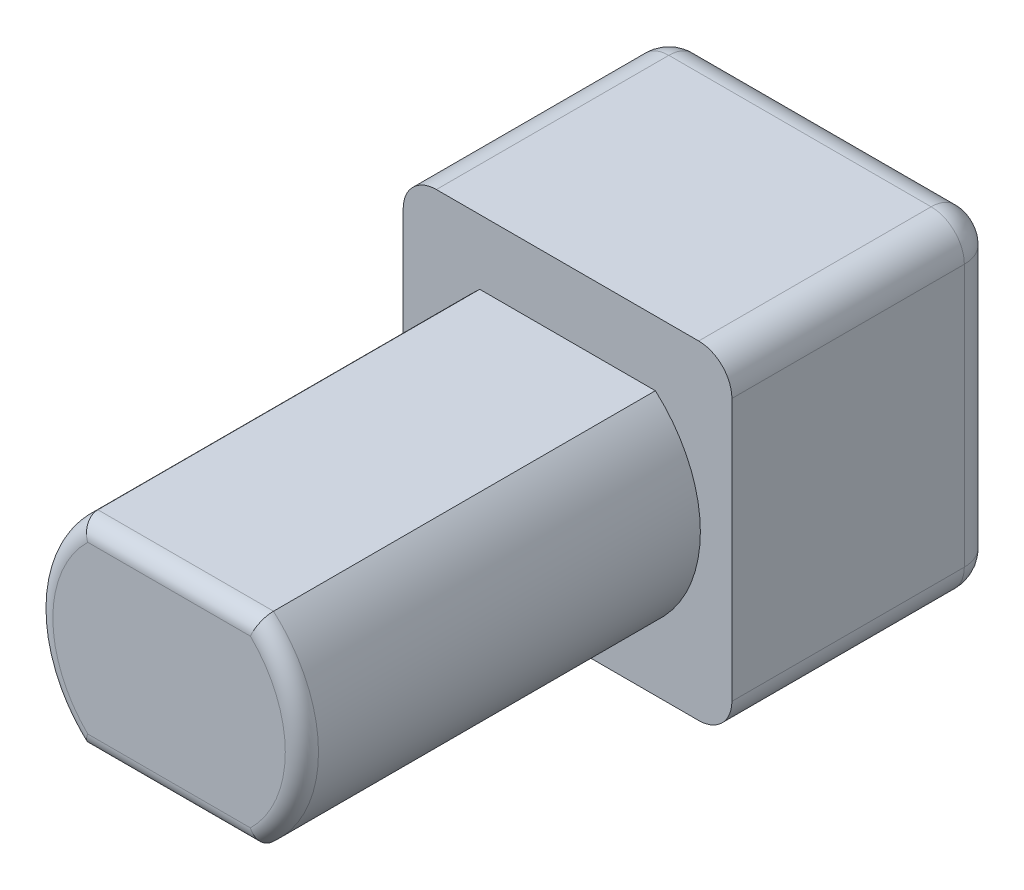
ISO-10303-21;
HEADER;
FILE_DESCRIPTION(('STEP AP214'),'2;1');
FILE_NAME('part.step','',(''),(''),'','','');
FILE_SCHEMA(('AUTOMOTIVE_DESIGN { 1 0 10303 214 1 1 1 1 }'));
ENDSEC;
DATA;
#1=APPLICATION_CONTEXT('core data for automotive mechanical design processes');
#2=APPLICATION_PROTOCOL_DEFINITION('international standard','automotive_design',2000,#1);
#3=PRODUCT_CONTEXT('',#1,'mechanical');
#4=PRODUCT('Part','Part','',(#3));
#5=PRODUCT_RELATED_PRODUCT_CATEGORY('part','',(#4));
#6=PRODUCT_DEFINITION_FORMATION('','',#4);
#7=PRODUCT_DEFINITION_CONTEXT('part definition',#1,'design');
#8=PRODUCT_DEFINITION('design','',#6,#7);
#9=PRODUCT_DEFINITION_SHAPE('','',#8);
#10=(LENGTH_UNIT() NAMED_UNIT(*) SI_UNIT(.MILLI.,.METRE.));
#11=(NAMED_UNIT(*) PLANE_ANGLE_UNIT() SI_UNIT($,.RADIAN.));
#12=(NAMED_UNIT(*) SI_UNIT($,.STERADIAN.) SOLID_ANGLE_UNIT());
#13=UNCERTAINTY_MEASURE_WITH_UNIT(LENGTH_MEASURE(1.E-05),#10,'distance_accuracy_value','');
#14=(GEOMETRIC_REPRESENTATION_CONTEXT(3) GLOBAL_UNCERTAINTY_ASSIGNED_CONTEXT((#13)) GLOBAL_UNIT_ASSIGNED_CONTEXT((#10,
#11,#12)) REPRESENTATION_CONTEXT('',''));
#15=CARTESIAN_POINT('',(0.,0.,0.));
#16=DIRECTION('',(0.,0.,1.));
#17=DIRECTION('',(1.,0.,0.));
#18=AXIS2_PLACEMENT_3D('',#15,#16,#17);
#19=CARTESIAN_POINT('',(-2.47487373415292,-2.47487373415292,0.));
#20=DIRECTION('',(0.,0.,1.));
#21=DIRECTION('',(1.,0.,0.));
#22=AXIS2_PLACEMENT_3D('',#19,#20,#21);
#23=PLANE('',#22);
#24=DIRECTION('',(1.,0.,0.));
#25=VECTOR('',#24,1.);
#26=CARTESIAN_POINT('',(-2.47487373415292,-2.47487373415292,0.));
#27=LINE('',#26,#25);
#28=CARTESIAN_POINT('',(-1.97487373415292,-2.47487373415292,0.));
#29=VERTEX_POINT('',#28);
#30=CARTESIAN_POINT('',(1.97487373415292,-2.47487373415292,0.));
#31=VERTEX_POINT('',#30);
#32=EDGE_CURVE('E180',#29,#31,#27,.T.);
#33=ORIENTED_EDGE('',*,*,#32,.T.);
#34=CARTESIAN_POINT('',(1.97487373415292,-1.97487373415292,0.));
#35=DIRECTION('',(0.,0.,1.));
#36=DIRECTION('',(1.,0.,0.));
#37=AXIS2_PLACEMENT_3D('',#34,#35,#36);
#38=CIRCLE('',#37,0.5);
#39=CARTESIAN_POINT('',(2.47487373415292,-1.97487373415292,0.));
#40=VERTEX_POINT('',#39);
#41=EDGE_CURVE('E202',#31,#40,#38,.T.);
#42=ORIENTED_EDGE('',*,*,#41,.T.);
#43=DIRECTION('',(0.,1.,0.));
#44=VECTOR('',#43,1.);
#45=CARTESIAN_POINT('',(2.47487373415292,2.47487373415292,0.));
#46=LINE('',#45,#44);
#47=CARTESIAN_POINT('',(2.47487373415292,1.97487373415292,0.));
#48=VERTEX_POINT('',#47);
#49=EDGE_CURVE('E183',#40,#48,#46,.T.);
#50=ORIENTED_EDGE('',*,*,#49,.T.);
#51=CARTESIAN_POINT('',(1.97487373415292,1.97487373415292,0.));
#52=DIRECTION('',(0.,0.,1.));
#53=DIRECTION('',(1.,0.,0.));
#54=AXIS2_PLACEMENT_3D('',#51,#52,#53);
#55=CIRCLE('',#54,0.5);
#56=CARTESIAN_POINT('',(1.97487373415292,2.47487373415292,0.));
#57=VERTEX_POINT('',#56);
#58=EDGE_CURVE('E200',#48,#57,#55,.T.);
#59=ORIENTED_EDGE('',*,*,#58,.T.);
#60=DIRECTION('',(-1.,0.,0.));
#61=VECTOR('',#60,1.);
#62=CARTESIAN_POINT('',(-2.47487373415292,2.47487373415292,0.));
#63=LINE('',#62,#61);
#64=CARTESIAN_POINT('',(-1.97487373415292,2.47487373415292,0.));
#65=VERTEX_POINT('',#64);
#66=EDGE_CURVE('E186',#57,#65,#63,.T.);
#67=ORIENTED_EDGE('',*,*,#66,.T.);
#68=CARTESIAN_POINT('',(-1.97487373415292,1.97487373415292,0.));
#69=DIRECTION('',(0.,0.,1.));
#70=DIRECTION('',(1.,0.,0.));
#71=AXIS2_PLACEMENT_3D('',#68,#69,#70);
#72=CIRCLE('',#71,0.5);
#73=CARTESIAN_POINT('',(-2.47487373415292,1.97487373415292,0.));
#74=VERTEX_POINT('',#73);
#75=EDGE_CURVE('E196',#65,#74,#72,.T.);
#76=ORIENTED_EDGE('',*,*,#75,.T.);
#77=DIRECTION('',(0.,-1.,0.));
#78=VECTOR('',#77,1.);
#79=CARTESIAN_POINT('',(-2.47487373415292,2.47487373415292,0.));
#80=LINE('',#79,#78);
#81=CARTESIAN_POINT('',(-2.47487373415292,-1.97487373415292,0.));
#82=VERTEX_POINT('',#81);
#83=EDGE_CURVE('E154',#74,#82,#80,.T.);
#84=ORIENTED_EDGE('',*,*,#83,.T.);
#85=CARTESIAN_POINT('',(-1.97487373415292,-1.97487373415292,0.));
#86=DIRECTION('',(0.,0.,1.));
#87=DIRECTION('',(1.,0.,0.));
#88=AXIS2_PLACEMENT_3D('',#85,#86,#87);
#89=CIRCLE('',#88,0.5);
#90=EDGE_CURVE('E198',#82,#29,#89,.T.);
#91=ORIENTED_EDGE('',*,*,#90,.T.);
#92=EDGE_LOOP('',(#33,#42,#50,#59,#67,#76,#84,#91));
#93=FACE_BOUND('',#92,.T.);
#94=DIRECTION('',(1.,0.,0.));
#95=VECTOR('',#94,1.);
#96=CARTESIAN_POINT('',(-1.3228756555323,-1.5,0.));
#97=LINE('',#96,#95);
#98=CARTESIAN_POINT('',(-1.3228756555323,-1.5,0.));
#99=VERTEX_POINT('',#98);
#100=CARTESIAN_POINT('',(1.32287565553229,-1.5,0.));
#101=VERTEX_POINT('',#100);
#102=EDGE_CURVE('E150',#99,#101,#97,.T.);
#103=ORIENTED_EDGE('',*,*,#102,.F.);
#104=CARTESIAN_POINT('',(0.,0.,0.));
#105=DIRECTION('',(0.,0.,1.));
#106=DIRECTION('',(1.,0.,0.));
#107=AXIS2_PLACEMENT_3D('',#104,#105,#106);
#108=CIRCLE('',#107,2.);
#109=CARTESIAN_POINT('',(-1.3228756555323,1.5,0.));
#110=VERTEX_POINT('',#109);
#111=EDGE_CURVE('E158',#110,#99,#108,.T.);
#112=ORIENTED_EDGE('',*,*,#111,.F.);
#113=DIRECTION('',(-1.,0.,0.));
#114=VECTOR('',#113,1.);
#115=CARTESIAN_POINT('',(-1.3228756555323,1.5,0.));
#116=LINE('',#115,#114);
#117=CARTESIAN_POINT('',(1.32287565553229,1.5,0.));
#118=VERTEX_POINT('',#117);
#119=EDGE_CURVE('E170',#118,#110,#116,.T.);
#120=ORIENTED_EDGE('',*,*,#119,.F.);
#121=CARTESIAN_POINT('',(0.,0.,0.));
#122=DIRECTION('',(0.,0.,1.));
#123=DIRECTION('',(1.,0.,0.));
#124=AXIS2_PLACEMENT_3D('',#121,#122,#123);
#125=CIRCLE('',#124,2.);
#126=EDGE_CURVE('E168',#101,#118,#125,.T.);
#127=ORIENTED_EDGE('',*,*,#126,.F.);
#128=EDGE_LOOP('',(#103,#112,#120,#127));
#129=FACE_BOUND('',#128,.T.);
#130=ADVANCED_FACE('F30',(#93,#129),#23,.T.);
#131=CARTESIAN_POINT('',(-2.47487373415292,2.47487373415292,-4.));
#132=DIRECTION('',(-1.,0.,0.));
#133=DIRECTION('',(0.,-1.,0.));
#134=AXIS2_PLACEMENT_3D('',#131,#132,#133);
#135=PLANE('',#134);
#136=DIRECTION('',(0.,-1.,0.));
#137=VECTOR('',#136,1.);
#138=CARTESIAN_POINT('',(-2.47487373415292,-2.47487373415292,-3.5));
#139=LINE('',#138,#137);
#140=CARTESIAN_POINT('',(-2.47487373415292,1.97487373415292,-3.5));
#141=VERTEX_POINT('',#140);
#142=CARTESIAN_POINT('',(-2.47487373415292,-1.97487373415292,-3.5));
#143=VERTEX_POINT('',#142);
#144=EDGE_CURVE('E227',#141,#143,#139,.T.);
#145=ORIENTED_EDGE('',*,*,#144,.T.);
#146=DIRECTION('',(0.,0.,1.));
#147=VECTOR('',#146,1.);
#148=CARTESIAN_POINT('',(-2.47487373415292,-1.97487373415292,-4.));
#149=LINE('',#148,#147);
#150=EDGE_CURVE('E229',#143,#82,#149,.T.);
#151=ORIENTED_EDGE('',*,*,#150,.T.);
#152=ORIENTED_EDGE('',*,*,#83,.F.);
#153=DIRECTION('',(0.,0.,1.));
#154=VECTOR('',#153,1.);
#155=CARTESIAN_POINT('',(-2.47487373415292,1.97487373415292,-4.));
#156=LINE('',#155,#154);
#157=EDGE_CURVE('E225',#74,#141,#156,.F.);
#158=ORIENTED_EDGE('',*,*,#157,.T.);
#159=EDGE_LOOP('',(#145,#151,#152,#158));
#160=FACE_BOUND('',#159,.T.);
#161=ADVANCED_FACE('F335',(#160),#135,.T.);
#162=CARTESIAN_POINT('',(-2.47487373415292,2.47487373415292,-4.));
#163=DIRECTION('',(0.,1.,0.));
#164=DIRECTION('',(0.,0.,1.));
#165=AXIS2_PLACEMENT_3D('',#162,#163,#164);
#166=PLANE('',#165);
#167=ORIENTED_EDGE('',*,*,#66,.F.);
#168=DIRECTION('',(0.,0.,1.));
#169=VECTOR('',#168,1.);
#170=CARTESIAN_POINT('',(1.97487373415292,2.47487373415292,-4.));
#171=LINE('',#170,#169);
#172=CARTESIAN_POINT('',(1.97487373415292,2.47487373415292,-3.5));
#173=VERTEX_POINT('',#172);
#174=EDGE_CURVE('E214',#57,#173,#171,.F.);
#175=ORIENTED_EDGE('',*,*,#174,.T.);
#176=DIRECTION('',(-1.,0.,0.));
#177=VECTOR('',#176,1.);
#178=CARTESIAN_POINT('',(-2.47487373415292,2.47487373415292,-3.5));
#179=LINE('',#178,#177);
#180=CARTESIAN_POINT('',(-1.97487373415292,2.47487373415292,-3.5));
#181=VERTEX_POINT('',#180);
#182=EDGE_CURVE('E212',#173,#181,#179,.T.);
#183=ORIENTED_EDGE('',*,*,#182,.T.);
#184=DIRECTION('',(0.,0.,1.));
#185=VECTOR('',#184,1.);
#186=CARTESIAN_POINT('',(-1.97487373415292,2.47487373415292,-4.));
#187=LINE('',#186,#185);
#188=EDGE_CURVE('E210',#181,#65,#187,.T.);
#189=ORIENTED_EDGE('',*,*,#188,.T.);
#190=EDGE_LOOP('',(#167,#175,#183,#189));
#191=FACE_BOUND('',#190,.T.);
#192=ADVANCED_FACE('F341',(#191),#166,.T.);
#193=CARTESIAN_POINT('',(2.47487373415292,2.47487373415292,-4.));
#194=DIRECTION('',(1.,0.,0.));
#195=DIRECTION('',(0.,1.,0.));
#196=AXIS2_PLACEMENT_3D('',#193,#194,#195);
#197=PLANE('',#196);
#198=ORIENTED_EDGE('',*,*,#49,.F.);
#199=DIRECTION('',(0.,0.,1.));
#200=VECTOR('',#199,1.);
#201=CARTESIAN_POINT('',(2.47487373415292,-1.97487373415292,-4.));
#202=LINE('',#201,#200);
#203=CARTESIAN_POINT('',(2.47487373415292,-1.97487373415292,-3.5));
#204=VERTEX_POINT('',#203);
#205=EDGE_CURVE('E208',#40,#204,#202,.F.);
#206=ORIENTED_EDGE('',*,*,#205,.T.);
#207=DIRECTION('',(0.,1.,0.));
#208=VECTOR('',#207,1.);
#209=CARTESIAN_POINT('',(2.47487373415292,2.47487373415292,-3.5));
#210=LINE('',#209,#208);
#211=CARTESIAN_POINT('',(2.47487373415292,1.97487373415292,-3.5));
#212=VERTEX_POINT('',#211);
#213=EDGE_CURVE('E204',#204,#212,#210,.T.);
#214=ORIENTED_EDGE('',*,*,#213,.T.);
#215=DIRECTION('',(0.,0.,1.));
#216=VECTOR('',#215,1.);
#217=CARTESIAN_POINT('',(2.47487373415292,1.97487373415292,-4.));
#218=LINE('',#217,#216);
#219=EDGE_CURVE('E206',#212,#48,#218,.T.);
#220=ORIENTED_EDGE('',*,*,#219,.T.);
#221=EDGE_LOOP('',(#198,#206,#214,#220));
#222=FACE_BOUND('',#221,.T.);
#223=ADVANCED_FACE('F350',(#222),#197,.T.);
#224=CARTESIAN_POINT('',(-2.47487373415292,-2.47487373415292,-4.));
#225=DIRECTION('',(0.,-1.,0.));
#226=DIRECTION('',(0.,0.,-1.));
#227=AXIS2_PLACEMENT_3D('',#224,#225,#226);
#228=PLANE('',#227);
#229=DIRECTION('',(1.,0.,0.));
#230=VECTOR('',#229,1.);
#231=CARTESIAN_POINT('',(2.47487373415292,-2.47487373415292,-3.5));
#232=LINE('',#231,#230);
#233=CARTESIAN_POINT('',(-1.97487373415292,-2.47487373415292,-3.5));
#234=VERTEX_POINT('',#233);
#235=CARTESIAN_POINT('',(1.97487373415292,-2.47487373415292,-3.5));
#236=VERTEX_POINT('',#235);
#237=EDGE_CURVE('E191',#234,#236,#232,.T.);
#238=ORIENTED_EDGE('',*,*,#237,.T.);
#239=DIRECTION('',(0.,0.,1.));
#240=VECTOR('',#239,1.);
#241=CARTESIAN_POINT('',(1.97487373415292,-2.47487373415292,-4.));
#242=LINE('',#241,#240);
#243=EDGE_CURVE('E193',#236,#31,#242,.T.);
#244=ORIENTED_EDGE('',*,*,#243,.T.);
#245=ORIENTED_EDGE('',*,*,#32,.F.);
#246=DIRECTION('',(0.,0.,1.));
#247=VECTOR('',#246,1.);
#248=CARTESIAN_POINT('',(-1.97487373415292,-2.47487373415292,-4.));
#249=LINE('',#248,#247);
#250=EDGE_CURVE('E189',#29,#234,#249,.F.);
#251=ORIENTED_EDGE('',*,*,#250,.T.);
#252=EDGE_LOOP('',(#238,#244,#245,#251));
#253=FACE_BOUND('',#252,.T.);
#254=ADVANCED_FACE('F354',(#253),#228,.T.);
#255=CARTESIAN_POINT('',(-2.47487373415292,-2.47487373415292,-4.));
#256=DIRECTION('',(0.,0.,1.));
#257=DIRECTION('',(1.,0.,0.));
#258=AXIS2_PLACEMENT_3D('',#255,#256,#257);
#259=PLANE('',#258);
#260=DIRECTION('',(0.,-1.,0.));
#261=VECTOR('',#260,1.);
#262=CARTESIAN_POINT('',(-1.97487373415292,2.47487373415292,-4.));
#263=LINE('',#262,#261);
#264=CARTESIAN_POINT('',(-1.97487373415292,-1.97487373415292,-4.));
#265=VERTEX_POINT('',#264);
#266=CARTESIAN_POINT('',(-1.97487373415292,1.97487373415292,-4.));
#267=VERTEX_POINT('',#266);
#268=EDGE_CURVE('E216',#265,#267,#263,.F.);
#269=ORIENTED_EDGE('',*,*,#268,.T.);
#270=DIRECTION('',(-1.,0.,0.));
#271=VECTOR('',#270,1.);
#272=CARTESIAN_POINT('',(2.47487373415292,1.97487373415292,-4.));
#273=LINE('',#272,#271);
#274=CARTESIAN_POINT('',(1.97487373415292,1.97487373415292,-4.));
#275=VERTEX_POINT('',#274);
#276=EDGE_CURVE('E222',#267,#275,#273,.F.);
#277=ORIENTED_EDGE('',*,*,#276,.T.);
#278=DIRECTION('',(0.,1.,0.));
#279=VECTOR('',#278,1.);
#280=CARTESIAN_POINT('',(1.97487373415292,-2.47487373415292,-4.));
#281=LINE('',#280,#279);
#282=CARTESIAN_POINT('',(1.97487373415292,-1.97487373415292,-4.));
#283=VERTEX_POINT('',#282);
#284=EDGE_CURVE('E220',#275,#283,#281,.F.);
#285=ORIENTED_EDGE('',*,*,#284,.T.);
#286=DIRECTION('',(1.,0.,0.));
#287=VECTOR('',#286,1.);
#288=CARTESIAN_POINT('',(-2.47487373415292,-1.97487373415292,-4.));
#289=LINE('',#288,#287);
#290=EDGE_CURVE('E218',#283,#265,#289,.F.);
#291=ORIENTED_EDGE('',*,*,#290,.T.);
#292=EDGE_LOOP('',(#269,#277,#285,#291));
#293=FACE_BOUND('',#292,.T.);
#294=ADVANCED_FACE('F346',(#293),#259,.F.);
#295=CARTESIAN_POINT('',(0.,0.,6.));
#296=DIRECTION('',(0.,0.,-1.));
#297=DIRECTION('',(-1.,0.,0.));
#298=AXIS2_PLACEMENT_3D('',#295,#296,#297);
#299=CYLINDRICAL_SURFACE('',#298,2.);
#300=DIRECTION('',(0.,0.,-1.));
#301=VECTOR('',#300,1.);
#302=CARTESIAN_POINT('',(-1.3228756555323,-1.5,6.));
#303=LINE('',#302,#301);
#304=CARTESIAN_POINT('',(-1.3228756555323,-1.5,5.75));
#305=VERTEX_POINT('',#304);
#306=EDGE_CURVE('E146',#305,#99,#303,.T.);
#307=ORIENTED_EDGE('',*,*,#306,.F.);
#308=CARTESIAN_POINT('',(0.,0.,5.75));
#309=DIRECTION('',(0.,0.,1.));
#310=DIRECTION('',(1.,0.,0.));
#311=AXIS2_PLACEMENT_3D('',#308,#309,#310);
#312=CIRCLE('',#311,2.);
#313=CARTESIAN_POINT('',(-1.3228756555323,1.5,5.75));
#314=VERTEX_POINT('',#313);
#315=EDGE_CURVE('E11',#305,#314,#312,.F.);
#316=ORIENTED_EDGE('',*,*,#315,.T.);
#317=DIRECTION('',(0.,0.,-1.));
#318=VECTOR('',#317,1.);
#319=CARTESIAN_POINT('',(-1.3228756555323,1.5,6.));
#320=LINE('',#319,#318);
#321=EDGE_CURVE('E161',#314,#110,#320,.T.);
#322=ORIENTED_EDGE('',*,*,#321,.T.);
#323=ORIENTED_EDGE('',*,*,#111,.T.);
#324=EDGE_LOOP('',(#307,#316,#322,#323));
#325=FACE_BOUND('',#324,.T.);
#326=ADVANCED_FACE('F159',(#325),#299,.T.);
#327=CARTESIAN_POINT('',(-1.3228756555323,-1.5,6.));
#328=DIRECTION('',(0.,1.,0.));
#329=DIRECTION('',(0.,0.,1.));
#330=AXIS2_PLACEMENT_3D('',#327,#328,#329);
#331=PLANE('',#330);
#332=DIRECTION('',(0.,0.,-1.));
#333=VECTOR('',#332,1.);
#334=CARTESIAN_POINT('',(1.32287565553229,-1.5,6.));
#335=LINE('',#334,#333);
#336=CARTESIAN_POINT('',(1.32287565553229,-1.5,5.75));
#337=VERTEX_POINT('',#336);
#338=EDGE_CURVE('E155',#337,#101,#335,.T.);
#339=ORIENTED_EDGE('',*,*,#338,.F.);
#340=DIRECTION('',(1.,0.,0.));
#341=VECTOR('',#340,1.);
#342=CARTESIAN_POINT('',(-1.3228756555323,-1.5,5.75));
#343=LINE('',#342,#341);
#344=EDGE_CURVE('E43',#337,#305,#343,.F.);
#345=ORIENTED_EDGE('',*,*,#344,.T.);
#346=ORIENTED_EDGE('',*,*,#306,.T.);
#347=ORIENTED_EDGE('',*,*,#102,.T.);
#348=EDGE_LOOP('',(#339,#345,#346,#347));
#349=FACE_BOUND('',#348,.T.);
#350=ADVANCED_FACE('F148',(#349),#331,.F.);
#351=CARTESIAN_POINT('',(0.,0.,6.));
#352=DIRECTION('',(0.,0.,-1.));
#353=DIRECTION('',(-1.,0.,0.));
#354=AXIS2_PLACEMENT_3D('',#351,#352,#353);
#355=CYLINDRICAL_SURFACE('',#354,2.);
#356=DIRECTION('',(0.,0.,-1.));
#357=VECTOR('',#356,1.);
#358=CARTESIAN_POINT('',(1.32287565553229,1.5,6.));
#359=LINE('',#358,#357);
#360=CARTESIAN_POINT('',(1.32287565553229,1.5,5.75));
#361=VERTEX_POINT('',#360);
#362=EDGE_CURVE('E175',#361,#118,#359,.T.);
#363=ORIENTED_EDGE('',*,*,#362,.F.);
#364=CARTESIAN_POINT('',(0.,0.,5.75));
#365=DIRECTION('',(0.,0.,1.));
#366=DIRECTION('',(1.,0.,0.));
#367=AXIS2_PLACEMENT_3D('',#364,#365,#366);
#368=CIRCLE('',#367,2.);
#369=EDGE_CURVE('E58',#361,#337,#368,.F.);
#370=ORIENTED_EDGE('',*,*,#369,.T.);
#371=ORIENTED_EDGE('',*,*,#338,.T.);
#372=ORIENTED_EDGE('',*,*,#126,.T.);
#373=EDGE_LOOP('',(#363,#370,#371,#372));
#374=FACE_BOUND('',#373,.T.);
#375=ADVANCED_FACE('F319',(#374),#355,.T.);
#376=CARTESIAN_POINT('',(-1.3228756555323,1.5,6.));
#377=DIRECTION('',(0.,-1.,0.));
#378=DIRECTION('',(0.,0.,-1.));
#379=AXIS2_PLACEMENT_3D('',#376,#377,#378);
#380=PLANE('',#379);
#381=ORIENTED_EDGE('',*,*,#321,.F.);
#382=DIRECTION('',(-1.,0.,0.));
#383=VECTOR('',#382,1.);
#384=CARTESIAN_POINT('',(1.32287565553229,1.5,5.75));
#385=LINE('',#384,#383);
#386=EDGE_CURVE('E275',#314,#361,#385,.F.);
#387=ORIENTED_EDGE('',*,*,#386,.T.);
#388=ORIENTED_EDGE('',*,*,#362,.T.);
#389=ORIENTED_EDGE('',*,*,#119,.T.);
#390=EDGE_LOOP('',(#381,#387,#388,#389));
#391=FACE_BOUND('',#390,.T.);
#392=ADVANCED_FACE('F318',(#391),#380,.F.);
#393=CARTESIAN_POINT('',(0.,0.,6.));
#394=DIRECTION('',(0.,0.,1.));
#395=DIRECTION('',(1.,0.,0.));
#396=AXIS2_PLACEMENT_3D('',#393,#394,#395);
#397=PLANE('',#396);
#398=CARTESIAN_POINT('',(0.,0.,6.));
#399=DIRECTION('',(0.,0.,1.));
#400=DIRECTION('',(1.,0.,0.));
#401=AXIS2_PLACEMENT_3D('',#398,#399,#400);
#402=CIRCLE('',#401,1.75);
#403=CARTESIAN_POINT('',(1.22474487139239,-1.25,6.));
#404=VERTEX_POINT('',#403);
#405=CARTESIAN_POINT('',(1.22474487139239,1.24999999999921,6.));
#406=VERTEX_POINT('',#405);
#407=EDGE_CURVE('E270',#404,#406,#402,.T.);
#408=ORIENTED_EDGE('',*,*,#407,.T.);
#409=DIRECTION('',(-1.,0.,0.));
#410=VECTOR('',#409,1.);
#411=CARTESIAN_POINT('',(-1.3228756555323,1.25,6.));
#412=LINE('',#411,#410);
#413=CARTESIAN_POINT('',(-1.22474487139239,1.24999999999921,6.));
#414=VERTEX_POINT('',#413);
#415=EDGE_CURVE('E272',#406,#414,#412,.T.);
#416=ORIENTED_EDGE('',*,*,#415,.T.);
#417=CARTESIAN_POINT('',(0.,0.,6.));
#418=DIRECTION('',(0.,0.,1.));
#419=DIRECTION('',(1.,0.,0.));
#420=AXIS2_PLACEMENT_3D('',#417,#418,#419);
#421=CIRCLE('',#420,1.75);
#422=CARTESIAN_POINT('',(-1.22474487139239,-1.24999999999921,6.));
#423=VERTEX_POINT('',#422);
#424=EDGE_CURVE('E231',#414,#423,#421,.T.);
#425=ORIENTED_EDGE('',*,*,#424,.T.);
#426=DIRECTION('',(1.,0.,0.));
#427=VECTOR('',#426,1.);
#428=CARTESIAN_POINT('',(1.32287565553229,-1.25,6.));
#429=LINE('',#428,#427);
#430=EDGE_CURVE('E268',#423,#404,#429,.T.);
#431=ORIENTED_EDGE('',*,*,#430,.T.);
#432=EDGE_LOOP('',(#408,#416,#425,#431));
#433=FACE_BOUND('',#432,.T.);
#434=ADVANCED_FACE('F323',(#433),#397,.T.);
#435=CARTESIAN_POINT('',(-1.97487373415292,1.97487373415292,-4.));
#436=DIRECTION('',(0.,0.,1.));
#437=DIRECTION('',(1.,0.,0.));
#438=AXIS2_PLACEMENT_3D('',#435,#436,#437);
#439=CYLINDRICAL_SURFACE('',#438,0.5);
#440=CARTESIAN_POINT('',(-1.97487373415292,1.97487373415292,-3.5));
#441=DIRECTION('',(0.,0.,-1.));
#442=DIRECTION('',(-1.,0.,0.));
#443=AXIS2_PLACEMENT_3D('',#440,#441,#442);
#444=CIRCLE('',#443,0.5);
#445=EDGE_CURVE('E165',#141,#181,#444,.T.);
#446=ORIENTED_EDGE('',*,*,#445,.F.);
#447=ORIENTED_EDGE('',*,*,#157,.F.);
#448=ORIENTED_EDGE('',*,*,#75,.F.);
#449=ORIENTED_EDGE('',*,*,#188,.F.);
#450=EDGE_LOOP('',(#446,#447,#448,#449));
#451=FACE_BOUND('',#450,.T.);
#452=ADVANCED_FACE('F325',(#451),#439,.T.);
#453=CARTESIAN_POINT('',(-1.97487373415292,1.97487373415292,-3.5));
#454=DIRECTION('',(0.,0.,1.));
#455=DIRECTION('',(1.,0.,0.));
#456=AXIS2_PLACEMENT_3D('',#453,#454,#455);
#457=SPHERICAL_SURFACE('',#456,0.5);
#458=CARTESIAN_POINT('',(-1.97487373415292,1.97487373415292,-3.5));
#459=DIRECTION('',(0.,1.,0.));
#460=DIRECTION('',(0.,0.,1.));
#461=AXIS2_PLACEMENT_3D('',#458,#459,#460);
#462=CIRCLE('',#461,0.5);
#463=EDGE_CURVE('E259',#141,#267,#462,.F.);
#464=ORIENTED_EDGE('',*,*,#463,.F.);
#465=ORIENTED_EDGE('',*,*,#445,.T.);
#466=CARTESIAN_POINT('',(-1.97487373415292,1.97487373415292,-3.5));
#467=DIRECTION('',(-1.,0.,0.));
#468=DIRECTION('',(0.,0.,1.));
#469=AXIS2_PLACEMENT_3D('',#466,#467,#468);
#470=CIRCLE('',#469,0.5);
#471=EDGE_CURVE('E262',#267,#181,#470,.F.);
#472=ORIENTED_EDGE('',*,*,#471,.F.);
#473=EDGE_LOOP('',(#464,#465,#472));
#474=FACE_BOUND('',#473,.T.);
#475=ADVANCED_FACE('F331',(#474),#457,.T.);
#476=CARTESIAN_POINT('',(1.97487373415292,1.97487373415292,-4.));
#477=DIRECTION('',(0.,0.,1.));
#478=DIRECTION('',(1.,0.,0.));
#479=AXIS2_PLACEMENT_3D('',#476,#477,#478);
#480=CYLINDRICAL_SURFACE('',#479,0.5);
#481=ORIENTED_EDGE('',*,*,#58,.F.);
#482=ORIENTED_EDGE('',*,*,#219,.F.);
#483=CARTESIAN_POINT('',(1.97487373415292,1.97487373415292,-3.5));
#484=DIRECTION('',(0.,0.,-1.));
#485=DIRECTION('',(-1.,0.,0.));
#486=AXIS2_PLACEMENT_3D('',#483,#484,#485);
#487=CIRCLE('',#486,0.5);
#488=EDGE_CURVE('E256',#173,#212,#487,.T.);
#489=ORIENTED_EDGE('',*,*,#488,.F.);
#490=ORIENTED_EDGE('',*,*,#174,.F.);
#491=EDGE_LOOP('',(#481,#482,#489,#490));
#492=FACE_BOUND('',#491,.T.);
#493=ADVANCED_FACE('F394',(#492),#480,.T.);
#494=CARTESIAN_POINT('',(-2.47487373415292,1.97487373415292,-3.5));
#495=DIRECTION('',(1.,0.,0.));
#496=DIRECTION('',(0.,0.,-1.));
#497=AXIS2_PLACEMENT_3D('',#494,#495,#496);
#498=CYLINDRICAL_SURFACE('',#497,0.5);
#499=ORIENTED_EDGE('',*,*,#471,.T.);
#500=ORIENTED_EDGE('',*,*,#182,.F.);
#501=CARTESIAN_POINT('',(1.97487373415292,1.97487373415292,-3.5));
#502=DIRECTION('',(1.,0.,0.));
#503=DIRECTION('',(0.,0.,-1.));
#504=AXIS2_PLACEMENT_3D('',#501,#502,#503);
#505=CIRCLE('',#504,0.5);
#506=EDGE_CURVE('E253',#275,#173,#505,.T.);
#507=ORIENTED_EDGE('',*,*,#506,.F.);
#508=ORIENTED_EDGE('',*,*,#276,.F.);
#509=EDGE_LOOP('',(#499,#500,#507,#508));
#510=FACE_BOUND('',#509,.T.);
#511=ADVANCED_FACE('F390',(#510),#498,.T.);
#512=CARTESIAN_POINT('',(-1.97487373415292,2.47487373415292,-3.5));
#513=DIRECTION('',(0.,1.,0.));
#514=DIRECTION('',(-1.,0.,0.));
#515=AXIS2_PLACEMENT_3D('',#512,#513,#514);
#516=CYLINDRICAL_SURFACE('',#515,0.5);
#517=ORIENTED_EDGE('',*,*,#463,.T.);
#518=ORIENTED_EDGE('',*,*,#268,.F.);
#519=CARTESIAN_POINT('',(-1.97487373415292,-1.97487373415292,-3.5));
#520=DIRECTION('',(0.,-1.,0.));
#521=DIRECTION('',(0.,0.,-1.));
#522=AXIS2_PLACEMENT_3D('',#519,#520,#521);
#523=CIRCLE('',#522,0.5);
#524=EDGE_CURVE('E250',#143,#265,#523,.T.);
#525=ORIENTED_EDGE('',*,*,#524,.F.);
#526=ORIENTED_EDGE('',*,*,#144,.F.);
#527=EDGE_LOOP('',(#517,#518,#525,#526));
#528=FACE_BOUND('',#527,.T.);
#529=ADVANCED_FACE('F386',(#528),#516,.T.);
#530=CARTESIAN_POINT('',(-1.97487373415292,-1.97487373415292,-4.));
#531=DIRECTION('',(0.,0.,1.));
#532=DIRECTION('',(1.,0.,0.));
#533=AXIS2_PLACEMENT_3D('',#530,#531,#532);
#534=CYLINDRICAL_SURFACE('',#533,0.5);
#535=ORIENTED_EDGE('',*,*,#90,.F.);
#536=ORIENTED_EDGE('',*,*,#150,.F.);
#537=CARTESIAN_POINT('',(-1.97487373415292,-1.97487373415292,-3.5));
#538=DIRECTION('',(0.,0.,-1.));
#539=DIRECTION('',(-1.,0.,0.));
#540=AXIS2_PLACEMENT_3D('',#537,#538,#539);
#541=CIRCLE('',#540,0.5);
#542=EDGE_CURVE('E247',#234,#143,#541,.T.);
#543=ORIENTED_EDGE('',*,*,#542,.F.);
#544=ORIENTED_EDGE('',*,*,#250,.F.);
#545=EDGE_LOOP('',(#535,#536,#543,#544));
#546=FACE_BOUND('',#545,.T.);
#547=ADVANCED_FACE('F382',(#546),#534,.T.);
#548=CARTESIAN_POINT('',(1.97487373415292,1.97487373415292,-3.5));
#549=DIRECTION('',(0.,0.,1.));
#550=DIRECTION('',(1.,0.,0.));
#551=AXIS2_PLACEMENT_3D('',#548,#549,#550);
#552=SPHERICAL_SURFACE('',#551,0.5);
#553=ORIENTED_EDGE('',*,*,#506,.T.);
#554=ORIENTED_EDGE('',*,*,#488,.T.);
#555=CARTESIAN_POINT('',(1.97487373415292,1.97487373415292,-3.5));
#556=DIRECTION('',(0.,1.,0.));
#557=DIRECTION('',(0.,0.,1.));
#558=AXIS2_PLACEMENT_3D('',#555,#556,#557);
#559=CIRCLE('',#558,0.5);
#560=EDGE_CURVE('E244',#275,#212,#559,.F.);
#561=ORIENTED_EDGE('',*,*,#560,.F.);
#562=EDGE_LOOP('',(#553,#554,#561));
#563=FACE_BOUND('',#562,.T.);
#564=ADVANCED_FACE('F378',(#563),#552,.T.);
#565=CARTESIAN_POINT('',(-1.97487373415292,-1.97487373415292,-3.5));
#566=DIRECTION('',(0.,0.,1.));
#567=DIRECTION('',(1.,0.,0.));
#568=AXIS2_PLACEMENT_3D('',#565,#566,#567);
#569=SPHERICAL_SURFACE('',#568,0.5);
#570=ORIENTED_EDGE('',*,*,#542,.T.);
#571=ORIENTED_EDGE('',*,*,#524,.T.);
#572=CARTESIAN_POINT('',(-1.97487373415292,-1.97487373415292,-3.5));
#573=DIRECTION('',(-1.,0.,0.));
#574=DIRECTION('',(0.,0.,1.));
#575=AXIS2_PLACEMENT_3D('',#572,#573,#574);
#576=CIRCLE('',#575,0.5);
#577=EDGE_CURVE('E241',#234,#265,#576,.F.);
#578=ORIENTED_EDGE('',*,*,#577,.F.);
#579=EDGE_LOOP('',(#570,#571,#578));
#580=FACE_BOUND('',#579,.T.);
#581=ADVANCED_FACE('F374',(#580),#569,.T.);
#582=CARTESIAN_POINT('',(1.97487373415292,2.47487373415292,-3.5));
#583=DIRECTION('',(0.,-1.,0.));
#584=DIRECTION('',(1.,0.,0.));
#585=AXIS2_PLACEMENT_3D('',#582,#583,#584);
#586=CYLINDRICAL_SURFACE('',#585,0.5);
#587=ORIENTED_EDGE('',*,*,#560,.T.);
#588=ORIENTED_EDGE('',*,*,#213,.F.);
#589=CARTESIAN_POINT('',(1.97487373415292,-1.97487373415292,-3.5));
#590=DIRECTION('',(0.,-1.,0.));
#591=DIRECTION('',(0.,0.,-1.));
#592=AXIS2_PLACEMENT_3D('',#589,#590,#591);
#593=CIRCLE('',#592,0.5);
#594=EDGE_CURVE('E238',#283,#204,#593,.T.);
#595=ORIENTED_EDGE('',*,*,#594,.F.);
#596=ORIENTED_EDGE('',*,*,#284,.F.);
#597=EDGE_LOOP('',(#587,#588,#595,#596));
#598=FACE_BOUND('',#597,.T.);
#599=ADVANCED_FACE('F370',(#598),#586,.T.);
#600=CARTESIAN_POINT('',(-2.47487373415292,-1.97487373415292,-3.5));
#601=DIRECTION('',(-1.,0.,0.));
#602=DIRECTION('',(0.,0.,1.));
#603=AXIS2_PLACEMENT_3D('',#600,#601,#602);
#604=CYLINDRICAL_SURFACE('',#603,0.5);
#605=ORIENTED_EDGE('',*,*,#577,.T.);
#606=ORIENTED_EDGE('',*,*,#290,.F.);
#607=CARTESIAN_POINT('',(1.97487373415292,-1.97487373415292,-3.5));
#608=DIRECTION('',(1.,0.,0.));
#609=DIRECTION('',(0.,0.,-1.));
#610=AXIS2_PLACEMENT_3D('',#607,#608,#609);
#611=CIRCLE('',#610,0.5);
#612=EDGE_CURVE('E235',#236,#283,#611,.T.);
#613=ORIENTED_EDGE('',*,*,#612,.F.);
#614=ORIENTED_EDGE('',*,*,#237,.F.);
#615=EDGE_LOOP('',(#605,#606,#613,#614));
#616=FACE_BOUND('',#615,.T.);
#617=ADVANCED_FACE('F366',(#616),#604,.T.);
#618=CARTESIAN_POINT('',(1.97487373415292,-1.97487373415292,-3.5));
#619=DIRECTION('',(0.,0.,1.));
#620=DIRECTION('',(1.,0.,0.));
#621=AXIS2_PLACEMENT_3D('',#618,#619,#620);
#622=SPHERICAL_SURFACE('',#621,0.5);
#623=ORIENTED_EDGE('',*,*,#612,.T.);
#624=ORIENTED_EDGE('',*,*,#594,.T.);
#625=CARTESIAN_POINT('',(1.97487373415292,-1.97487373415292,-3.5));
#626=DIRECTION('',(0.,0.,-1.));
#627=DIRECTION('',(-1.,0.,0.));
#628=AXIS2_PLACEMENT_3D('',#625,#626,#627);
#629=CIRCLE('',#628,0.5);
#630=EDGE_CURVE('E232',#236,#204,#629,.F.);
#631=ORIENTED_EDGE('',*,*,#630,.F.);
#632=EDGE_LOOP('',(#623,#624,#631));
#633=FACE_BOUND('',#632,.T.);
#634=ADVANCED_FACE('F362',(#633),#622,.T.);
#635=CARTESIAN_POINT('',(1.97487373415292,-1.97487373415292,-4.));
#636=DIRECTION('',(0.,0.,1.));
#637=DIRECTION('',(1.,0.,0.));
#638=AXIS2_PLACEMENT_3D('',#635,#636,#637);
#639=CYLINDRICAL_SURFACE('',#638,0.5);
#640=ORIENTED_EDGE('',*,*,#630,.T.);
#641=ORIENTED_EDGE('',*,*,#205,.F.);
#642=ORIENTED_EDGE('',*,*,#41,.F.);
#643=ORIENTED_EDGE('',*,*,#243,.F.);
#644=EDGE_LOOP('',(#640,#641,#642,#643));
#645=FACE_BOUND('',#644,.T.);
#646=ADVANCED_FACE('F359',(#645),#639,.T.);
#647=CARTESIAN_POINT('',(0.,-1.25,5.75));
#648=DIRECTION('',(-1.,0.,0.));
#649=DIRECTION('',(0.,0.,1.));
#650=AXIS2_PLACEMENT_3D('',#647,#648,#649);
#651=CYLINDRICAL_SURFACE('',#650,0.25);
#652=CARTESIAN_POINT('',(-1.3228756555323,-1.5,5.75));
#653=CARTESIAN_POINT('',(-1.32288043942927,-1.50001460787941,5.76339823933284));
#654=CARTESIAN_POINT('',(-1.32246892663244,-1.49892391777188,5.7767879483732));
#655=CARTESIAN_POINT('',(-1.32085064101542,-1.49464524935072,5.80314632535262));
#656=CARTESIAN_POINT('',(-1.31964580663411,-1.49146238318972,5.8161159389312));
#657=CARTESIAN_POINT('',(-1.31647807766724,-1.48311218348259,5.84129746751821));
#658=CARTESIAN_POINT('',(-1.31451527479418,-1.47794509002397,5.85350947398799));
#659=CARTESIAN_POINT('',(-1.3098950548356,-1.46581969869838,5.87686589855548));
#660=CARTESIAN_POINT('',(-1.30723745938367,-1.45886094088421,5.88801004150704));
#661=CARTESIAN_POINT('',(-1.30122881024574,-1.44318719702933,5.90923969998412));
#662=CARTESIAN_POINT('',(-1.29786171477706,-1.43443173434541,5.91929072074697));
#663=CARTESIAN_POINT('',(-1.29057163987912,-1.41556188140365,5.93778695848247));
#664=CARTESIAN_POINT('',(-1.28664847604926,-1.4054470404135,5.94623164058473));
#665=CARTESIAN_POINT('',(-1.27809046920039,-1.38349585727951,5.96182796891935));
#666=CARTESIAN_POINT('',(-1.27342673744297,-1.37159198545756,5.96886857071026));
#667=CARTESIAN_POINT('',(-1.26370315417488,-1.34692205802764,5.98085535882696));
#668=CARTESIAN_POINT('',(-1.25864323113848,-1.33415584679605,5.98580116593474));
#669=CARTESIAN_POINT('',(-1.24904647270933,-1.31009767186742,5.99294216585484));
#670=CARTESIAN_POINT('',(-1.24454808435024,-1.2988790677508,5.99544246450432));
#671=CARTESIAN_POINT('',(-1.23543121828063,-1.27626960286655,5.9988779562786));
#672=CARTESIAN_POINT('',(-1.23081297654502,-1.26487909669027,5.99981601823614));
#673=CARTESIAN_POINT('',(-1.22569709047827,-1.25233312672412,5.99999185278595));
#674=CARTESIAN_POINT('',(-1.22522107311834,-1.25116644581299,6.00000001968268));
#675=CARTESIAN_POINT('',(-1.22474487139159,-1.25,6.));
#676=B_SPLINE_CURVE_WITH_KNOTS('',3,(#652,#653,#654,#655,#656,#657,#658,#659,#660,#661,#662,
#663,#664,#665,#666,#667,#668,#669,#670,#671,#672,#673,#674,#675),.UNSPECIFIED.,.F.,.F.,(4,2,2,
2,2,2,2,2,2,2,2,4),(0.,0.040130942721209,0.0801641897123576,0.12019259428663,0.160231285017947,
0.201297188863015,0.242376742777165,0.285975335064153,0.329581816579232,0.366515158141393,
0.403380601613962,0.40716071947177),.UNSPECIFIED.);
#677=EDGE_CURVE('E301',#305,#423,#676,.T.);
#678=ORIENTED_EDGE('',*,*,#677,.F.);
#679=ORIENTED_EDGE('',*,*,#344,.F.);
#680=CARTESIAN_POINT('',(1.32287565553229,-1.5,5.75));
#681=CARTESIAN_POINT('',(1.32288043942927,-1.50001460787941,5.76339823933284));
#682=CARTESIAN_POINT('',(1.32246892663244,-1.49892391777188,5.7767879483732));
#683=CARTESIAN_POINT('',(1.32085064101542,-1.49464524935072,5.80314632535262));
#684=CARTESIAN_POINT('',(1.31964580663411,-1.49146238318972,5.8161159389312));
#685=CARTESIAN_POINT('',(1.31647807766724,-1.48311218348259,5.84129746751821));
#686=CARTESIAN_POINT('',(1.31451527479418,-1.47794509002397,5.85350947398799));
#687=CARTESIAN_POINT('',(1.3098950548356,-1.46581969869838,5.87686589855548));
#688=CARTESIAN_POINT('',(1.30723745938367,-1.45886094088421,5.88801004150704));
#689=CARTESIAN_POINT('',(1.30122881024574,-1.44318719702933,5.90923969998412));
#690=CARTESIAN_POINT('',(1.29786171477706,-1.43443173434541,5.91929072074697));
#691=CARTESIAN_POINT('',(1.29057163987912,-1.41556188140365,5.93778695848247));
#692=CARTESIAN_POINT('',(1.28664847604926,-1.4054470404135,5.94623164058473));
#693=CARTESIAN_POINT('',(1.27809046920039,-1.38349585727951,5.96182796891935));
#694=CARTESIAN_POINT('',(1.27342673744297,-1.37159198545756,5.96886857071026));
#695=CARTESIAN_POINT('',(1.26370315417488,-1.34692205802764,5.98085535882696));
#696=CARTESIAN_POINT('',(1.25864323113848,-1.33415584679605,5.98580116593474));
#697=CARTESIAN_POINT('',(1.24904647270933,-1.31009767186742,5.99294216585484));
#698=CARTESIAN_POINT('',(1.24454808435024,-1.2988790677508,5.99544246450432));
#699=CARTESIAN_POINT('',(1.23543121828063,-1.27626960286655,5.9988779562786));
#700=CARTESIAN_POINT('',(1.23081297654502,-1.26487909669027,5.99981601823614));
#701=CARTESIAN_POINT('',(1.22569709047827,-1.25233312672412,5.99999185278595));
#702=CARTESIAN_POINT('',(1.22522107311833,-1.25116644581299,6.00000001968268));
#703=CARTESIAN_POINT('',(1.22474487139159,-1.25,6.));
#704=B_SPLINE_CURVE_WITH_KNOTS('',3,(#680,#681,#682,#683,#684,#685,#686,#687,#688,#689,#690,
#691,#692,#693,#694,#695,#696,#697,#698,#699,#700,#701,#702,#703),.UNSPECIFIED.,.F.,.F.,(4,2,2,
2,2,2,2,2,2,2,2,4),(0.,0.040130942721209,0.0801641897123577,0.12019259428663,0.160231285017947,
0.201297188863015,0.242376742777165,0.285975335064153,0.329581816579232,0.366515158141393,
0.403380601613962,0.407160719471769),.UNSPECIFIED.);
#705=EDGE_CURVE('E35',#404,#337,#704,.F.);
#706=ORIENTED_EDGE('',*,*,#705,.F.);
#707=ORIENTED_EDGE('',*,*,#430,.F.);
#708=EDGE_LOOP('',(#678,#679,#706,#707));
#709=FACE_BOUND('',#708,.T.);
#710=ADVANCED_FACE('F32',(#709),#651,.T.);
#711=CARTESIAN_POINT('',(0.,0.,5.75));
#712=DIRECTION('',(0.,0.,1.));
#713=DIRECTION('',(1.,0.,0.));
#714=AXIS2_PLACEMENT_3D('',#711,#712,#713);
#715=TOROIDAL_SURFACE('',#714,1.75,0.25);
#716=ORIENTED_EDGE('',*,*,#705,.T.);
#717=ORIENTED_EDGE('',*,*,#369,.F.);
#718=CARTESIAN_POINT('',(1.32287565553229,1.5,5.75));
#719=CARTESIAN_POINT('',(1.32288043942927,1.50001460787941,5.76339823933284));
#720=CARTESIAN_POINT('',(1.32246892663244,1.49892391777188,5.7767879483732));
#721=CARTESIAN_POINT('',(1.32085064101542,1.49464524935072,5.80314632535262));
#722=CARTESIAN_POINT('',(1.31964580663411,1.49146238318972,5.8161159389312));
#723=CARTESIAN_POINT('',(1.31647807766724,1.48311218348259,5.84129746751821));
#724=CARTESIAN_POINT('',(1.31451527479418,1.47794509002397,5.85350947398799));
#725=CARTESIAN_POINT('',(1.3098950548356,1.46581969869838,5.87686589855548));
#726=CARTESIAN_POINT('',(1.30723745938367,1.45886094088421,5.88801004150704));
#727=CARTESIAN_POINT('',(1.30122881024574,1.44318719702933,5.90923969998412));
#728=CARTESIAN_POINT('',(1.29786171477705,1.43443173434541,5.91929072074697));
#729=CARTESIAN_POINT('',(1.29057163987912,1.41556188140365,5.93778695848247));
#730=CARTESIAN_POINT('',(1.28664847604926,1.4054470404135,5.94623164058473));
#731=CARTESIAN_POINT('',(1.27809046920039,1.38349585727951,5.96182796891935));
#732=CARTESIAN_POINT('',(1.27342673744297,1.37159198545756,5.96886857071026));
#733=CARTESIAN_POINT('',(1.26370315417488,1.34692205802764,5.98085535882696));
#734=CARTESIAN_POINT('',(1.25864323113848,1.33415584679605,5.98580116593474));
#735=CARTESIAN_POINT('',(1.24904647270933,1.31009767186742,5.99294216585484));
#736=CARTESIAN_POINT('',(1.24454808435024,1.2988790677508,5.99544246450432));
#737=CARTESIAN_POINT('',(1.23543121828063,1.27626960286655,5.9988779562786));
#738=CARTESIAN_POINT('',(1.23081297654502,1.26487909669027,5.99981601823614));
#739=CARTESIAN_POINT('',(1.22569709047827,1.25233312672412,5.99999185278595));
#740=CARTESIAN_POINT('',(1.22522107311834,1.25116644581299,6.00000001968268));
#741=CARTESIAN_POINT('',(1.22474487139159,1.25,6.));
#742=B_SPLINE_CURVE_WITH_KNOTS('',3,(#718,#719,#720,#721,#722,#723,#724,#725,#726,#727,#728,
#729,#730,#731,#732,#733,#734,#735,#736,#737,#738,#739,#740,#741),.UNSPECIFIED.,.F.,.F.,(4,2,2,
2,2,2,2,2,2,2,2,4),(0.,0.040130942721209,0.0801641897123576,0.12019259428663,0.160231285017947,
0.201297188863015,0.242376742777165,0.285975335064153,0.329581816579232,0.366515158141393,
0.403380601613962,0.40716071947177),.UNSPECIFIED.);
#743=EDGE_CURVE('E287',#406,#361,#742,.F.);
#744=ORIENTED_EDGE('',*,*,#743,.F.);
#745=ORIENTED_EDGE('',*,*,#407,.F.);
#746=EDGE_LOOP('',(#716,#717,#744,#745));
#747=FACE_BOUND('',#746,.T.);
#748=ADVANCED_FACE('F297',(#747),#715,.T.);
#749=CARTESIAN_POINT('',(0.,0.,5.75));
#750=DIRECTION('',(0.,0.,1.));
#751=DIRECTION('',(1.,0.,0.));
#752=AXIS2_PLACEMENT_3D('',#749,#750,#751);
#753=TOROIDAL_SURFACE('',#752,1.75,0.25);
#754=ORIENTED_EDGE('',*,*,#677,.T.);
#755=ORIENTED_EDGE('',*,*,#424,.F.);
#756=CARTESIAN_POINT('',(-1.3228756555323,1.5,5.75));
#757=CARTESIAN_POINT('',(-1.32288043942927,1.50001460787941,5.76339823933284));
#758=CARTESIAN_POINT('',(-1.32246892663244,1.49892391777188,5.7767879483732));
#759=CARTESIAN_POINT('',(-1.32085064101542,1.49464524935072,5.80314632535262));
#760=CARTESIAN_POINT('',(-1.31964580663411,1.49146238318972,5.8161159389312));
#761=CARTESIAN_POINT('',(-1.31647807766724,1.48311218348259,5.84129746751821));
#762=CARTESIAN_POINT('',(-1.31451527479418,1.47794509002397,5.85350947398799));
#763=CARTESIAN_POINT('',(-1.3098950548356,1.46581969869838,5.87686589855548));
#764=CARTESIAN_POINT('',(-1.30723745938367,1.45886094088421,5.88801004150704));
#765=CARTESIAN_POINT('',(-1.30122881024574,1.44318719702933,5.90923969998412));
#766=CARTESIAN_POINT('',(-1.29786171477706,1.43443173434541,5.91929072074697));
#767=CARTESIAN_POINT('',(-1.29057163987912,1.41556188140365,5.93778695848247));
#768=CARTESIAN_POINT('',(-1.28664847604926,1.4054470404135,5.94623164058473));
#769=CARTESIAN_POINT('',(-1.2780904692004,1.38349585727951,5.96182796891935));
#770=CARTESIAN_POINT('',(-1.27342673744297,1.37159198545756,5.96886857071026));
#771=CARTESIAN_POINT('',(-1.26370315417488,1.34692205802764,5.98085535882696));
#772=CARTESIAN_POINT('',(-1.25864323113849,1.33415584679605,5.98580116593474));
#773=CARTESIAN_POINT('',(-1.24904647270933,1.31009767186742,5.99294216585484));
#774=CARTESIAN_POINT('',(-1.24454808435024,1.2988790677508,5.99544246450432));
#775=CARTESIAN_POINT('',(-1.23543121828063,1.27626960286655,5.9988779562786));
#776=CARTESIAN_POINT('',(-1.23081297654502,1.26487909669027,5.99981601823614));
#777=CARTESIAN_POINT('',(-1.22569709047827,1.25233312672412,5.99999185278595));
#778=CARTESIAN_POINT('',(-1.22522107311834,1.25116644581299,6.00000001968268));
#779=CARTESIAN_POINT('',(-1.22474487139159,1.25,6.));
#780=B_SPLINE_CURVE_WITH_KNOTS('',3,(#756,#757,#758,#759,#760,#761,#762,#763,#764,#765,#766,
#767,#768,#769,#770,#771,#772,#773,#774,#775,#776,#777,#778,#779),.UNSPECIFIED.,.F.,.F.,(4,2,2,
2,2,2,2,2,2,2,2,4),(0.,0.040130942721209,0.0801641897123576,0.12019259428663,0.160231285017947,
0.201297188863015,0.242376742777165,0.285975335064152,0.329581816579232,0.366515158141393,
0.403380601613962,0.40716071947177),.UNSPECIFIED.);
#781=EDGE_CURVE('E280',#314,#414,#780,.T.);
#782=ORIENTED_EDGE('',*,*,#781,.F.);
#783=ORIENTED_EDGE('',*,*,#315,.F.);
#784=EDGE_LOOP('',(#754,#755,#782,#783));
#785=FACE_BOUND('',#784,.T.);
#786=ADVANCED_FACE('F294',(#785),#753,.T.);
#787=CARTESIAN_POINT('',(0.,1.25,5.75));
#788=DIRECTION('',(1.,0.,0.));
#789=DIRECTION('',(0.,0.,-1.));
#790=AXIS2_PLACEMENT_3D('',#787,#788,#789);
#791=CYLINDRICAL_SURFACE('',#790,0.25);
#792=ORIENTED_EDGE('',*,*,#743,.T.);
#793=ORIENTED_EDGE('',*,*,#386,.F.);
#794=ORIENTED_EDGE('',*,*,#781,.T.);
#795=ORIENTED_EDGE('',*,*,#415,.F.);
#796=EDGE_LOOP('',(#792,#793,#794,#795));
#797=FACE_BOUND('',#796,.T.);
#798=ADVANCED_FACE('F291',(#797),#791,.T.);
#799=CLOSED_SHELL('',(#130,#161,#192,#223,#254,#294,#326,#350,#375,#392,#434,#452,#475,#493,
#511,#529,#547,#564,#581,#599,#617,#634,#646,#710,#748,#786,#798));
#800=MANIFOLD_SOLID_BREP('B2',#799);
#801=ADVANCED_BREP_SHAPE_REPRESENTATION('',(#18,#800),#14);
#802=SHAPE_DEFINITION_REPRESENTATION(#9,#801);
ENDSEC;
END-ISO-10303-21;
